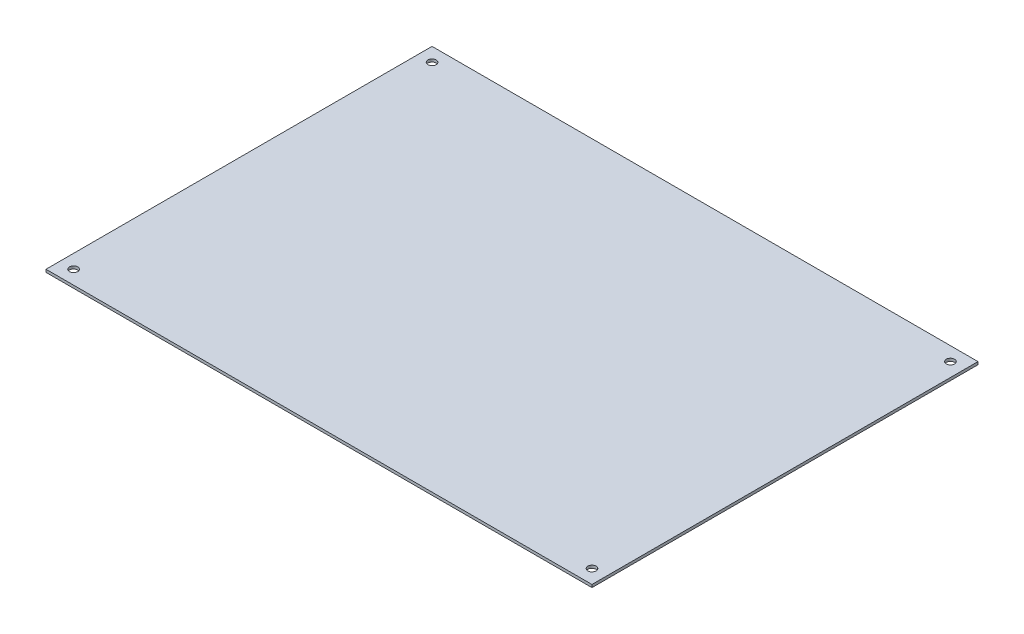
ISO-10303-21;
HEADER;
FILE_DESCRIPTION(('STEP AP214'),'2;1');
FILE_NAME('part.step','',(''),(''),'','','');
FILE_SCHEMA(('AUTOMOTIVE_DESIGN { 1 0 10303 214 1 1 1 1 }'));
ENDSEC;
DATA;
#1=APPLICATION_CONTEXT('core data for automotive mechanical design processes');
#2=APPLICATION_PROTOCOL_DEFINITION('international standard','automotive_design',2000,#1);
#3=PRODUCT_CONTEXT('',#1,'mechanical');
#4=PRODUCT('Part','Part','',(#3));
#5=PRODUCT_RELATED_PRODUCT_CATEGORY('part','',(#4));
#6=PRODUCT_DEFINITION_FORMATION('','',#4);
#7=PRODUCT_DEFINITION_CONTEXT('part definition',#1,'design');
#8=PRODUCT_DEFINITION('design','',#6,#7);
#9=PRODUCT_DEFINITION_SHAPE('','',#8);
#10=(LENGTH_UNIT() NAMED_UNIT(*) SI_UNIT(.MILLI.,.METRE.));
#11=(NAMED_UNIT(*) PLANE_ANGLE_UNIT() SI_UNIT($,.RADIAN.));
#12=(NAMED_UNIT(*) SI_UNIT($,.STERADIAN.) SOLID_ANGLE_UNIT());
#13=UNCERTAINTY_MEASURE_WITH_UNIT(LENGTH_MEASURE(1.E-05),#10,'distance_accuracy_value','');
#14=(GEOMETRIC_REPRESENTATION_CONTEXT(3) GLOBAL_UNCERTAINTY_ASSIGNED_CONTEXT((#13)) GLOBAL_UNIT_ASSIGNED_CONTEXT((#10,
#11,#12)) REPRESENTATION_CONTEXT('',''));
#15=CARTESIAN_POINT('',(0.,0.,0.));
#16=DIRECTION('',(0.,0.,1.));
#17=DIRECTION('',(1.,0.,0.));
#18=AXIS2_PLACEMENT_3D('',#15,#16,#17);
#19=CARTESIAN_POINT('',(-148.5,1.5,105.));
#20=DIRECTION('',(1.,0.,0.));
#21=DIRECTION('',(0.,0.,-1.));
#22=AXIS2_PLACEMENT_3D('',#19,#20,#21);
#23=PLANE('',#22);
#24=DIRECTION('',(0.,0.,1.));
#25=VECTOR('',#24,1.);
#26=CARTESIAN_POINT('',(-148.5,0.,105.));
#27=LINE('',#26,#25);
#28=CARTESIAN_POINT('',(-148.5,0.,-105.));
#29=VERTEX_POINT('',#28);
#30=CARTESIAN_POINT('',(-148.5,0.,105.));
#31=VERTEX_POINT('',#30);
#32=EDGE_CURVE('E95',#29,#31,#27,.T.);
#33=ORIENTED_EDGE('',*,*,#32,.T.);
#34=DIRECTION('',(0.,-1.,0.));
#35=VECTOR('',#34,1.);
#36=CARTESIAN_POINT('',(-148.5,1.5,105.));
#37=LINE('',#36,#35);
#38=CARTESIAN_POINT('',(-148.5,1.5,105.));
#39=VERTEX_POINT('',#38);
#40=EDGE_CURVE('E11',#39,#31,#37,.T.);
#41=ORIENTED_EDGE('',*,*,#40,.F.);
#42=DIRECTION('',(0.,0.,1.));
#43=VECTOR('',#42,1.);
#44=CARTESIAN_POINT('',(-148.5,1.5,105.));
#45=LINE('',#44,#43);
#46=CARTESIAN_POINT('',(-148.5,1.5,-105.));
#47=VERTEX_POINT('',#46);
#48=EDGE_CURVE('E83',#47,#39,#45,.T.);
#49=ORIENTED_EDGE('',*,*,#48,.F.);
#50=DIRECTION('',(0.,-1.,0.));
#51=VECTOR('',#50,1.);
#52=CARTESIAN_POINT('',(-148.5,1.5,-105.));
#53=LINE('',#52,#51);
#54=EDGE_CURVE('E91',#47,#29,#53,.T.);
#55=ORIENTED_EDGE('',*,*,#54,.T.);
#56=EDGE_LOOP('',(#33,#41,#49,#55));
#57=FACE_BOUND('',#56,.T.);
#58=ADVANCED_FACE('F32',(#57),#23,.F.);
#59=CARTESIAN_POINT('',(148.5,1.5,105.));
#60=DIRECTION('',(0.,0.,-1.));
#61=DIRECTION('',(-1.,0.,0.));
#62=AXIS2_PLACEMENT_3D('',#59,#60,#61);
#63=PLANE('',#62);
#64=DIRECTION('',(1.,0.,0.));
#65=VECTOR('',#64,1.);
#66=CARTESIAN_POINT('',(148.5,0.,105.));
#67=LINE('',#66,#65);
#68=CARTESIAN_POINT('',(148.5,0.,105.));
#69=VERTEX_POINT('',#68);
#70=EDGE_CURVE('E87',#31,#69,#67,.T.);
#71=ORIENTED_EDGE('',*,*,#70,.T.);
#72=DIRECTION('',(0.,-1.,0.));
#73=VECTOR('',#72,1.);
#74=CARTESIAN_POINT('',(148.5,1.5,105.));
#75=LINE('',#74,#73);
#76=CARTESIAN_POINT('',(148.5,1.5,105.));
#77=VERTEX_POINT('',#76);
#78=EDGE_CURVE('E40',#77,#69,#75,.T.);
#79=ORIENTED_EDGE('',*,*,#78,.F.);
#80=DIRECTION('',(1.,0.,0.));
#81=VECTOR('',#80,1.);
#82=CARTESIAN_POINT('',(148.5,1.5,105.));
#83=LINE('',#82,#81);
#84=EDGE_CURVE('E78',#39,#77,#83,.T.);
#85=ORIENTED_EDGE('',*,*,#84,.F.);
#86=ORIENTED_EDGE('',*,*,#40,.T.);
#87=EDGE_LOOP('',(#71,#79,#85,#86));
#88=FACE_BOUND('',#87,.T.);
#89=ADVANCED_FACE('F86',(#88),#63,.F.);
#90=CARTESIAN_POINT('',(148.5,1.5,105.));
#91=DIRECTION('',(-1.,0.,0.));
#92=DIRECTION('',(0.,0.,1.));
#93=AXIS2_PLACEMENT_3D('',#90,#91,#92);
#94=PLANE('',#93);
#95=DIRECTION('',(0.,0.,-1.));
#96=VECTOR('',#95,1.);
#97=CARTESIAN_POINT('',(148.5,0.,105.));
#98=LINE('',#97,#96);
#99=CARTESIAN_POINT('',(148.5,0.,-105.));
#100=VERTEX_POINT('',#99);
#101=EDGE_CURVE('E65',#69,#100,#98,.T.);
#102=ORIENTED_EDGE('',*,*,#101,.T.);
#103=DIRECTION('',(0.,-1.,0.));
#104=VECTOR('',#103,1.);
#105=CARTESIAN_POINT('',(148.5,1.5,-105.));
#106=LINE('',#105,#104);
#107=CARTESIAN_POINT('',(148.5,1.5,-105.));
#108=VERTEX_POINT('',#107);
#109=EDGE_CURVE('E88',#108,#100,#106,.T.);
#110=ORIENTED_EDGE('',*,*,#109,.F.);
#111=DIRECTION('',(0.,0.,-1.));
#112=VECTOR('',#111,1.);
#113=CARTESIAN_POINT('',(148.5,1.5,105.));
#114=LINE('',#113,#112);
#115=EDGE_CURVE('E81',#77,#108,#114,.T.);
#116=ORIENTED_EDGE('',*,*,#115,.F.);
#117=ORIENTED_EDGE('',*,*,#78,.T.);
#118=EDGE_LOOP('',(#102,#110,#116,#117));
#119=FACE_BOUND('',#118,.T.);
#120=ADVANCED_FACE('F89',(#119),#94,.F.);
#121=CARTESIAN_POINT('',(148.5,1.5,-105.));
#122=DIRECTION('',(0.,0.,1.));
#123=DIRECTION('',(1.,0.,0.));
#124=AXIS2_PLACEMENT_3D('',#121,#122,#123);
#125=PLANE('',#124);
#126=DIRECTION('',(-1.,0.,0.));
#127=VECTOR('',#126,1.);
#128=CARTESIAN_POINT('',(148.5,0.,-105.));
#129=LINE('',#128,#127);
#130=EDGE_CURVE('E71',#100,#29,#129,.T.);
#131=ORIENTED_EDGE('',*,*,#130,.T.);
#132=ORIENTED_EDGE('',*,*,#54,.F.);
#133=DIRECTION('',(-1.,0.,0.));
#134=VECTOR('',#133,1.);
#135=CARTESIAN_POINT('',(148.5,1.5,-105.));
#136=LINE('',#135,#134);
#137=EDGE_CURVE('E48',#108,#47,#136,.T.);
#138=ORIENTED_EDGE('',*,*,#137,.F.);
#139=ORIENTED_EDGE('',*,*,#109,.T.);
#140=EDGE_LOOP('',(#131,#132,#138,#139));
#141=FACE_BOUND('',#140,.T.);
#142=ADVANCED_FACE('F103',(#141),#125,.F.);
#143=CARTESIAN_POINT('',(0.,1.5,0.));
#144=DIRECTION('',(0.,1.,0.));
#145=DIRECTION('',(0.,0.,1.));
#146=AXIS2_PLACEMENT_3D('',#143,#144,#145);
#147=PLANE('',#146);
#148=CARTESIAN_POINT('',(-140.9999974,1.5,-97.5000082));
#149=DIRECTION('',(0.,1.,0.));
#150=DIRECTION('',(0.,0.,1.));
#151=AXIS2_PLACEMENT_3D('',#148,#149,#150);
#152=CIRCLE('',#151,2.25);
#153=CARTESIAN_POINT('',(-140.9999974,1.5,-95.2500082));
#154=VERTEX_POINT('',#153);
#155=EDGE_CURVE('E129',#154,#154,#152,.T.);
#156=ORIENTED_EDGE('',*,*,#155,.F.);
#157=EDGE_LOOP('',(#156));
#158=FACE_BOUND('',#157,.T.);
#159=CARTESIAN_POINT('',(-140.9999974,1.5,97.5000082));
#160=DIRECTION('',(0.,1.,0.));
#161=DIRECTION('',(0.,0.,1.));
#162=AXIS2_PLACEMENT_3D('',#159,#160,#161);
#163=CIRCLE('',#162,2.25);
#164=CARTESIAN_POINT('',(-140.9999974,1.5,99.7500082));
#165=VERTEX_POINT('',#164);
#166=EDGE_CURVE('E123',#165,#165,#163,.T.);
#167=ORIENTED_EDGE('',*,*,#166,.F.);
#168=EDGE_LOOP('',(#167));
#169=FACE_BOUND('',#168,.T.);
#170=CARTESIAN_POINT('',(140.9999974,1.5,97.5000082));
#171=DIRECTION('',(0.,1.,0.));
#172=DIRECTION('',(0.,0.,1.));
#173=AXIS2_PLACEMENT_3D('',#170,#171,#172);
#174=CIRCLE('',#173,2.25);
#175=CARTESIAN_POINT('',(140.9999974,1.5,99.7500082));
#176=VERTEX_POINT('',#175);
#177=EDGE_CURVE('E117',#176,#176,#174,.T.);
#178=ORIENTED_EDGE('',*,*,#177,.F.);
#179=EDGE_LOOP('',(#178));
#180=FACE_BOUND('',#179,.T.);
#181=CARTESIAN_POINT('',(140.9999974,1.5,-97.5000082));
#182=DIRECTION('',(0.,1.,0.));
#183=DIRECTION('',(0.,0.,1.));
#184=AXIS2_PLACEMENT_3D('',#181,#182,#183);
#185=CIRCLE('',#184,2.25);
#186=CARTESIAN_POINT('',(140.9999974,1.5,-95.2500082));
#187=VERTEX_POINT('',#186);
#188=EDGE_CURVE('E111',#187,#187,#185,.T.);
#189=ORIENTED_EDGE('',*,*,#188,.F.);
#190=EDGE_LOOP('',(#189));
#191=FACE_BOUND('',#190,.T.);
#192=ORIENTED_EDGE('',*,*,#48,.T.);
#193=ORIENTED_EDGE('',*,*,#84,.T.);
#194=ORIENTED_EDGE('',*,*,#115,.T.);
#195=ORIENTED_EDGE('',*,*,#137,.T.);
#196=EDGE_LOOP('',(#192,#193,#194,#195));
#197=FACE_BOUND('',#196,.T.);
#198=ADVANCED_FACE('F79',(#158,#169,#180,#191,#197),#147,.T.);
#199=CARTESIAN_POINT('',(0.,0.,0.));
#200=DIRECTION('',(0.,1.,0.));
#201=DIRECTION('',(0.,0.,1.));
#202=AXIS2_PLACEMENT_3D('',#199,#200,#201);
#203=PLANE('',#202);
#204=CARTESIAN_POINT('',(-140.9999974,0.,-97.5000082));
#205=DIRECTION('',(0.,1.,0.));
#206=DIRECTION('',(0.,0.,1.));
#207=AXIS2_PLACEMENT_3D('',#204,#205,#206);
#208=CIRCLE('',#207,2.25);
#209=CARTESIAN_POINT('',(-140.9999974,0.,-95.2500082));
#210=VERTEX_POINT('',#209);
#211=EDGE_CURVE('E126',#210,#210,#208,.T.);
#212=ORIENTED_EDGE('',*,*,#211,.T.);
#213=EDGE_LOOP('',(#212));
#214=FACE_BOUND('',#213,.T.);
#215=CARTESIAN_POINT('',(-140.9999974,0.,97.5000082));
#216=DIRECTION('',(0.,1.,0.));
#217=DIRECTION('',(0.,0.,1.));
#218=AXIS2_PLACEMENT_3D('',#215,#216,#217);
#219=CIRCLE('',#218,2.25);
#220=CARTESIAN_POINT('',(-140.9999974,0.,99.7500082));
#221=VERTEX_POINT('',#220);
#222=EDGE_CURVE('E120',#221,#221,#219,.T.);
#223=ORIENTED_EDGE('',*,*,#222,.T.);
#224=EDGE_LOOP('',(#223));
#225=FACE_BOUND('',#224,.T.);
#226=CARTESIAN_POINT('',(140.9999974,0.,97.5000082));
#227=DIRECTION('',(0.,1.,0.));
#228=DIRECTION('',(0.,0.,1.));
#229=AXIS2_PLACEMENT_3D('',#226,#227,#228);
#230=CIRCLE('',#229,2.25);
#231=CARTESIAN_POINT('',(140.9999974,0.,99.7500082));
#232=VERTEX_POINT('',#231);
#233=EDGE_CURVE('E114',#232,#232,#230,.T.);
#234=ORIENTED_EDGE('',*,*,#233,.T.);
#235=EDGE_LOOP('',(#234));
#236=FACE_BOUND('',#235,.T.);
#237=CARTESIAN_POINT('',(140.9999974,0.,-97.5000082));
#238=DIRECTION('',(0.,1.,0.));
#239=DIRECTION('',(0.,0.,1.));
#240=AXIS2_PLACEMENT_3D('',#237,#238,#239);
#241=CIRCLE('',#240,2.25);
#242=CARTESIAN_POINT('',(140.9999974,0.,-95.2500082));
#243=VERTEX_POINT('',#242);
#244=EDGE_CURVE('E98',#243,#243,#241,.T.);
#245=ORIENTED_EDGE('',*,*,#244,.T.);
#246=EDGE_LOOP('',(#245));
#247=FACE_BOUND('',#246,.T.);
#248=ORIENTED_EDGE('',*,*,#32,.F.);
#249=ORIENTED_EDGE('',*,*,#130,.F.);
#250=ORIENTED_EDGE('',*,*,#101,.F.);
#251=ORIENTED_EDGE('',*,*,#70,.F.);
#252=EDGE_LOOP('',(#248,#249,#250,#251));
#253=FACE_BOUND('',#252,.T.);
#254=ADVANCED_FACE('F106',(#214,#225,#236,#247,#253),#203,.F.);
#255=CARTESIAN_POINT('',(140.9999974,1.5,-97.5000082));
#256=DIRECTION('',(0.,1.,0.));
#257=DIRECTION('',(0.,0.,1.));
#258=AXIS2_PLACEMENT_3D('',#255,#256,#257);
#259=CYLINDRICAL_SURFACE('',#258,2.25);
#260=ORIENTED_EDGE('',*,*,#244,.F.);
#261=EDGE_LOOP('',(#260));
#262=FACE_BOUND('',#261,.T.);
#263=ORIENTED_EDGE('',*,*,#188,.T.);
#264=EDGE_LOOP('',(#263));
#265=FACE_BOUND('',#264,.T.);
#266=ADVANCED_FACE('F144',(#262,#265),#259,.F.);
#267=CARTESIAN_POINT('',(140.9999974,1.5,97.5000082));
#268=DIRECTION('',(0.,1.,0.));
#269=DIRECTION('',(0.,0.,1.));
#270=AXIS2_PLACEMENT_3D('',#267,#268,#269);
#271=CYLINDRICAL_SURFACE('',#270,2.25);
#272=ORIENTED_EDGE('',*,*,#233,.F.);
#273=EDGE_LOOP('',(#272));
#274=FACE_BOUND('',#273,.T.);
#275=ORIENTED_EDGE('',*,*,#177,.T.);
#276=EDGE_LOOP('',(#275));
#277=FACE_BOUND('',#276,.T.);
#278=ADVANCED_FACE('F146',(#274,#277),#271,.F.);
#279=CARTESIAN_POINT('',(-140.9999974,1.5,97.5000082));
#280=DIRECTION('',(0.,1.,0.));
#281=DIRECTION('',(0.,0.,1.));
#282=AXIS2_PLACEMENT_3D('',#279,#280,#281);
#283=CYLINDRICAL_SURFACE('',#282,2.25);
#284=ORIENTED_EDGE('',*,*,#222,.F.);
#285=EDGE_LOOP('',(#284));
#286=FACE_BOUND('',#285,.T.);
#287=ORIENTED_EDGE('',*,*,#166,.T.);
#288=EDGE_LOOP('',(#287));
#289=FACE_BOUND('',#288,.T.);
#290=ADVANCED_FACE('F153',(#286,#289),#283,.F.);
#291=CARTESIAN_POINT('',(-140.9999974,1.5,-97.5000082));
#292=DIRECTION('',(0.,1.,0.));
#293=DIRECTION('',(0.,0.,1.));
#294=AXIS2_PLACEMENT_3D('',#291,#292,#293);
#295=CYLINDRICAL_SURFACE('',#294,2.25);
#296=ORIENTED_EDGE('',*,*,#211,.F.);
#297=EDGE_LOOP('',(#296));
#298=FACE_BOUND('',#297,.T.);
#299=ORIENTED_EDGE('',*,*,#155,.T.);
#300=EDGE_LOOP('',(#299));
#301=FACE_BOUND('',#300,.T.);
#302=ADVANCED_FACE('F133',(#298,#301),#295,.F.);
#303=CLOSED_SHELL('',(#58,#89,#120,#142,#198,#254,#266,#278,#290,#302));
#304=MANIFOLD_SOLID_BREP('B2',#303);
#305=ADVANCED_BREP_SHAPE_REPRESENTATION('',(#18,#304),#14);
#306=SHAPE_DEFINITION_REPRESENTATION(#9,#305);
ENDSEC;
END-ISO-10303-21;
